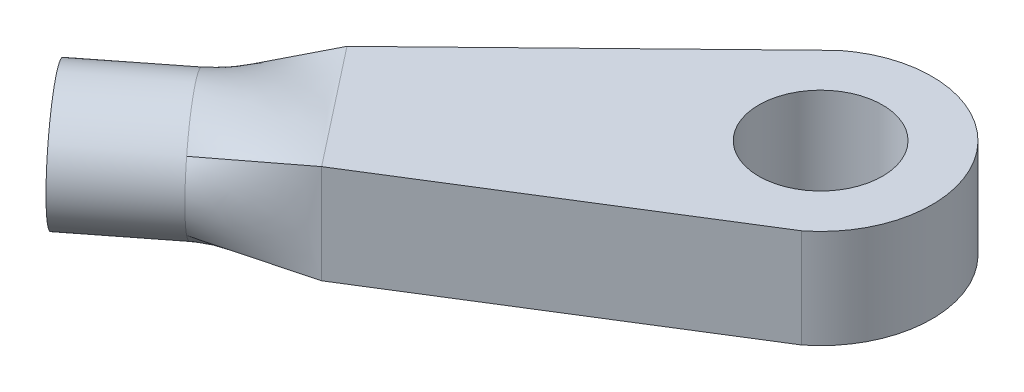
ISO-10303-21;
HEADER;
FILE_DESCRIPTION(('STEP AP214'),'2;1');
FILE_NAME('part.step','',(''),(''),'','','');
FILE_SCHEMA(('AUTOMOTIVE_DESIGN { 1 0 10303 214 1 1 1 1 }'));
ENDSEC;
DATA;
#1=APPLICATION_CONTEXT('core data for automotive mechanical design processes');
#2=APPLICATION_PROTOCOL_DEFINITION('international standard','automotive_design',2000,#1);
#3=PRODUCT_CONTEXT('',#1,'mechanical');
#4=PRODUCT('Part','Part','',(#3));
#5=PRODUCT_RELATED_PRODUCT_CATEGORY('part','',(#4));
#6=PRODUCT_DEFINITION_FORMATION('','',#4);
#7=PRODUCT_DEFINITION_CONTEXT('part definition',#1,'design');
#8=PRODUCT_DEFINITION('design','',#6,#7);
#9=PRODUCT_DEFINITION_SHAPE('','',#8);
#10=(LENGTH_UNIT() NAMED_UNIT(*) SI_UNIT(.MILLI.,.METRE.));
#11=(NAMED_UNIT(*) PLANE_ANGLE_UNIT() SI_UNIT($,.RADIAN.));
#12=(NAMED_UNIT(*) SI_UNIT($,.STERADIAN.) SOLID_ANGLE_UNIT());
#13=UNCERTAINTY_MEASURE_WITH_UNIT(LENGTH_MEASURE(1.E-05),#10,'distance_accuracy_value','');
#14=(GEOMETRIC_REPRESENTATION_CONTEXT(3) GLOBAL_UNCERTAINTY_ASSIGNED_CONTEXT((#13)) GLOBAL_UNIT_ASSIGNED_CONTEXT((#10,
#11,#12)) REPRESENTATION_CONTEXT('',''));
#15=CARTESIAN_POINT('',(0.,0.,0.));
#16=DIRECTION('',(0.,0.,1.));
#17=DIRECTION('',(1.,0.,0.));
#18=AXIS2_PLACEMENT_3D('',#15,#16,#17);
#19=CARTESIAN_POINT('',(2.368376701358,4.,3.79621636558901));
#20=DIRECTION('',(-0.529314363787313,0.,-0.848425780070615));
#21=DIRECTION('',(-0.848425780070615,0.,0.529314363787313));
#22=AXIS2_PLACEMENT_3D('',#19,#20,#21);
#23=PLANE('',#22);
#24=DIRECTION('',(0.848425780070615,0.,-0.529314363787313));
#25=VECTOR('',#24,1.);
#26=CARTESIAN_POINT('',(2.368376701358,0.,3.79621636558901));
#27=LINE('',#26,#25);
#28=CARTESIAN_POINT('',(-9.1786423882137,0.,11.0001500585608));
#29=VERTEX_POINT('',#28);
#30=CARTESIAN_POINT('',(2.77485421300522,0.,3.54262389995992));
#31=VERTEX_POINT('',#30);
#32=EDGE_CURVE('E216',#29,#31,#27,.T.);
#33=ORIENTED_EDGE('',*,*,#32,.T.);
#34=DIRECTION('',(0.,-1.,0.));
#35=VECTOR('',#34,1.);
#36=CARTESIAN_POINT('',(2.77485421300522,4.,3.54262389995992));
#37=LINE('',#36,#35);
#38=CARTESIAN_POINT('',(2.77485421300522,4.,3.54262389995992));
#39=VERTEX_POINT('',#38);
#40=EDGE_CURVE('E12',#39,#31,#37,.T.);
#41=ORIENTED_EDGE('',*,*,#40,.F.);
#42=DIRECTION('',(0.848425780070615,0.,-0.529314363787313));
#43=VECTOR('',#42,1.);
#44=CARTESIAN_POINT('',(2.368376701358,4.,3.79621636558901));
#45=LINE('',#44,#43);
#46=CARTESIAN_POINT('',(-9.17864238821368,4.,11.0001500585608));
#47=VERTEX_POINT('',#46);
#48=EDGE_CURVE('E219',#47,#39,#45,.T.);
#49=ORIENTED_EDGE('',*,*,#48,.F.);
#50=DIRECTION('',(0.,1.,0.));
#51=VECTOR('',#50,1.);
#52=CARTESIAN_POINT('',(-9.17864238821372,4.,11.0001500585608));
#53=LINE('',#52,#51);
#54=EDGE_CURVE('E232',#47,#29,#53,.F.);
#55=ORIENTED_EDGE('',*,*,#54,.T.);
#56=EDGE_LOOP('',(#33,#41,#49,#55));
#57=FACE_BOUND('',#56,.T.);
#58=ADVANCED_FACE('F68',(#57),#23,.F.);
#59=CARTESIAN_POINT('',(0.,4.,0.));
#60=DIRECTION('',(0.,-1.,0.));
#61=DIRECTION('',(0.,0.,-1.));
#62=AXIS2_PLACEMENT_3D('',#59,#60,#61);
#63=CYLINDRICAL_SURFACE('',#62,4.5);
#64=CARTESIAN_POINT('',(0.,0.,0.));
#65=DIRECTION('',(0.,1.,0.));
#66=DIRECTION('',(0.,0.,1.));
#67=AXIS2_PLACEMENT_3D('',#64,#65,#66);
#68=CIRCLE('',#67,4.5);
#69=CARTESIAN_POINT('',(-2.77485421300522,0.,-3.54262389995991));
#70=VERTEX_POINT('',#69);
#71=EDGE_CURVE('E208',#31,#70,#68,.T.);
#72=ORIENTED_EDGE('',*,*,#71,.T.);
#73=DIRECTION('',(0.,-1.,0.));
#74=VECTOR('',#73,1.);
#75=CARTESIAN_POINT('',(-2.77485421300522,4.,-3.54262389995991));
#76=LINE('',#75,#74);
#77=CARTESIAN_POINT('',(-2.77485421300522,4.,-3.54262389995991));
#78=VERTEX_POINT('',#77);
#79=EDGE_CURVE('E78',#78,#70,#76,.T.);
#80=ORIENTED_EDGE('',*,*,#79,.F.);
#81=CARTESIAN_POINT('',(0.,4.,0.));
#82=DIRECTION('',(0.,1.,0.));
#83=DIRECTION('',(0.,0.,1.));
#84=AXIS2_PLACEMENT_3D('',#81,#82,#83);
#85=CIRCLE('',#84,4.5);
#86=EDGE_CURVE('E226',#39,#78,#85,.T.);
#87=ORIENTED_EDGE('',*,*,#86,.F.);
#88=ORIENTED_EDGE('',*,*,#40,.T.);
#89=EDGE_LOOP('',(#72,#80,#87,#88));
#90=FACE_BOUND('',#89,.T.);
#91=ADVANCED_FACE('F198',(#90),#63,.T.);
#92=CARTESIAN_POINT('',(-3.11842595611097,4.,-3.20872037581255));
#93=DIRECTION('',(-0.696944725908792,0.,-0.717124848982322));
#94=DIRECTION('',(-0.717124848982322,0.,0.696944725908792));
#95=AXIS2_PLACEMENT_3D('',#92,#93,#94);
#96=PLANE('',#95);
#97=DIRECTION('',(0.717124848982322,0.,-0.696944725908792));
#98=VECTOR('',#97,1.);
#99=CARTESIAN_POINT('',(-3.11842595611097,0.,-3.20872037581255));
#100=LINE('',#99,#98);
#101=CARTESIAN_POINT('',(-12.878448005554,0.,6.27665152528097));
#102=VERTEX_POINT('',#101);
#103=EDGE_CURVE('E215',#102,#70,#100,.T.);
#104=ORIENTED_EDGE('',*,*,#103,.F.);
#105=DIRECTION('',(0.,1.,0.));
#106=VECTOR('',#105,1.);
#107=CARTESIAN_POINT('',(-12.878448005554,4.,6.27665152528095));
#108=LINE('',#107,#106);
#109=CARTESIAN_POINT('',(-12.878448005554,4.,6.27665152528093));
#110=VERTEX_POINT('',#109);
#111=EDGE_CURVE('E229',#110,#102,#108,.F.);
#112=ORIENTED_EDGE('',*,*,#111,.F.);
#113=DIRECTION('',(0.717124848982322,0.,-0.696944725908792));
#114=VECTOR('',#113,1.);
#115=CARTESIAN_POINT('',(-3.11842595611097,4.,-3.20872037581255));
#116=LINE('',#115,#114);
#117=EDGE_CURVE('E224',#110,#78,#116,.T.);
#118=ORIENTED_EDGE('',*,*,#117,.T.);
#119=ORIENTED_EDGE('',*,*,#79,.T.);
#120=EDGE_LOOP('',(#104,#112,#118,#119));
#121=FACE_BOUND('',#120,.T.);
#122=ADVANCED_FACE('F192',(#121),#96,.T.);
#123=CARTESIAN_POINT('',(0.,4.,0.));
#124=DIRECTION('',(0.,1.,0.));
#125=DIRECTION('',(0.,0.,1.));
#126=AXIS2_PLACEMENT_3D('',#123,#124,#125);
#127=PLANE('',#126);
#128=CARTESIAN_POINT('',(0.,4.,0.));
#129=DIRECTION('',(0.,1.,0.));
#130=DIRECTION('',(0.,0.,1.));
#131=AXIS2_PLACEMENT_3D('',#128,#129,#130);
#132=CIRCLE('',#131,2.5);
#133=CARTESIAN_POINT('',(0.,4.,2.5));
#134=VERTEX_POINT('',#133);
#135=EDGE_CURVE('E152',#134,#134,#132,.T.);
#136=ORIENTED_EDGE('',*,*,#135,.F.);
#137=EDGE_LOOP('',(#136));
#138=FACE_BOUND('',#137,.T.);
#139=ORIENTED_EDGE('',*,*,#48,.T.);
#140=ORIENTED_EDGE('',*,*,#86,.T.);
#141=ORIENTED_EDGE('',*,*,#117,.F.);
#142=DIRECTION('',(0.616634269556715,0.,0.787249755546648));
#143=VECTOR('',#142,1.);
#144=CARTESIAN_POINT('',(-12.878448005554,4.,6.27665152528095));
#145=LINE('',#144,#143);
#146=EDGE_CURVE('E86',#110,#47,#145,.T.);
#147=ORIENTED_EDGE('',*,*,#146,.T.);
#148=EDGE_LOOP('',(#139,#140,#141,#147));
#149=FACE_BOUND('',#148,.T.);
#150=ADVANCED_FACE('F189',(#138,#149),#127,.T.);
#151=CARTESIAN_POINT('',(0.,0.,0.));
#152=DIRECTION('',(0.,1.,0.));
#153=DIRECTION('',(0.,0.,1.));
#154=AXIS2_PLACEMENT_3D('',#151,#152,#153);
#155=PLANE('',#154);
#156=CARTESIAN_POINT('',(0.,0.,0.));
#157=DIRECTION('',(0.,1.,0.));
#158=DIRECTION('',(0.,0.,1.));
#159=AXIS2_PLACEMENT_3D('',#156,#157,#158);
#160=CIRCLE('',#159,2.5);
#161=CARTESIAN_POINT('',(0.,0.,2.5));
#162=VERTEX_POINT('',#161);
#163=EDGE_CURVE('E223',#162,#162,#160,.T.);
#164=ORIENTED_EDGE('',*,*,#163,.T.);
#165=EDGE_LOOP('',(#164));
#166=FACE_BOUND('',#165,.T.);
#167=ORIENTED_EDGE('',*,*,#32,.F.);
#168=DIRECTION('',(-0.616634269556715,0.,-0.787249755546648));
#169=VECTOR('',#168,1.);
#170=CARTESIAN_POINT('',(-9.17864238821371,0.,11.0001500585608));
#171=LINE('',#170,#169);
#172=EDGE_CURVE('E142',#102,#29,#171,.F.);
#173=ORIENTED_EDGE('',*,*,#172,.F.);
#174=ORIENTED_EDGE('',*,*,#103,.T.);
#175=ORIENTED_EDGE('',*,*,#71,.F.);
#176=EDGE_LOOP('',(#167,#173,#174,#175));
#177=FACE_BOUND('',#176,.T.);
#178=ADVANCED_FACE('F187',(#166,#177),#155,.F.);
#179=CARTESIAN_POINT('',(0.,-2.,0.));
#180=DIRECTION('',(0.,1.,0.));
#181=DIRECTION('',(0.,0.,1.));
#182=AXIS2_PLACEMENT_3D('',#179,#180,#181);
#183=CYLINDRICAL_SURFACE('',#182,2.5);
#184=ORIENTED_EDGE('',*,*,#135,.T.);
#185=EDGE_LOOP('',(#184));
#186=FACE_BOUND('',#185,.T.);
#187=ORIENTED_EDGE('',*,*,#163,.F.);
#188=EDGE_LOOP('',(#187));
#189=FACE_BOUND('',#188,.T.);
#190=ADVANCED_FACE('F178',(#186,#189),#183,.F.);
#191=CARTESIAN_POINT('',(-12.878448005554,4.,6.27665152528095));
#192=CARTESIAN_POINT('',(-15.4602210327791,3.37313717208592,9.4673593930978));
#193=CARTESIAN_POINT('',(-12.878448005554,3.66666666666667,6.27665152528095));
#194=CARTESIAN_POINT('',(-15.5392767083633,3.18082947977823,9.36642993725848));
#195=CARTESIAN_POINT('',(-12.878448005554,3.33333333333333,6.27665152528095));
#196=CARTESIAN_POINT('',(-15.6050319848207,2.9619739900238,9.28248094533141));
#197=CARTESIAN_POINT('',(-12.878448005554,2.66666666666666,6.27665152528095));
#198=CARTESIAN_POINT('',(-15.695072172049,2.49075943487762,9.16752769202648));
#199=CARTESIAN_POINT('',(-12.878448005554,2.33333333333333,6.27665152528095));
#200=CARTESIAN_POINT('',(-15.7191298929622,2.23869971296617,9.13681348128113));
#201=CARTESIAN_POINT('',(-12.878448005554,1.66666666666666,6.27665152528095));
#202=CARTESIAN_POINT('',(-15.7191298929622,1.73407365007952,9.13681348128114));
#203=CARTESIAN_POINT('',(-12.878448005554,1.33333333333333,6.27665152528095));
#204=CARTESIAN_POINT('',(-15.695072172049,1.48201392816807,9.16752769202648));
#205=CARTESIAN_POINT('',(-12.878448005554,0.666666666666666,6.27665152528095));
#206=CARTESIAN_POINT('',(-15.6050319848207,1.01079937302189,9.28248094533141));
#207=CARTESIAN_POINT('',(-12.878448005554,0.333333333333333,6.27665152528095));
#208=CARTESIAN_POINT('',(-15.5392767083633,0.791943883267464,9.36642993725848));
#209=CARTESIAN_POINT('',(-12.878448005554,0.,6.27665152528095));
#210=CARTESIAN_POINT('',(-15.4602210327791,0.599636190959771,9.4673593930978));
#211=B_SPLINE_SURFACE_WITH_KNOTS('',3,1,((#191,#192),(#193,#194),(#195,#196),(#197,#198),(#199,
#200),(#201,#202),(#203,#204),(#205,#206),(#207,#208),(#209,#210)),.UNSPECIFIED.,.F.,.F.,.F.,(4,
2,2,2,4),(2,2),(0.,0.25,0.5,0.75,1.),(0.,1.),.UNSPECIFIED.);
#212=DIRECTION('',(-0.622417047974724,0.144561037666866,0.769219815643818));
#213=VECTOR('',#212,1.);
#214=CARTESIAN_POINT('',(-14.1693345191666,0.299818095479886,7.87200545918938));
#215=LINE('',#214,#213);
#216=CARTESIAN_POINT('',(-15.4603416391705,0.599505949114852,9.46720541632942));
#217=VERTEX_POINT('',#216);
#218=EDGE_CURVE('E146',#102,#217,#215,.T.);
#219=CARTESIAN_POINT('',(-14.1775442190704,1.98638668152284,11.1049378701478));
#220=DIRECTION('',(-0.787249755546648,0.,0.616634269556715));
#221=DIRECTION('',(0.616634269556715,0.,0.787249755546648));
#222=AXIS2_PLACEMENT_3D('',#219,#220,#221);
#223=CIRCLE('',#222,2.5);
#224=CARTESIAN_POINT('',(-15.4603417728438,3.37326782402596,9.46720524567022));
#225=VERTEX_POINT('',#224);
#226=EDGE_CURVE('E71',#217,#225,#223,.F.);
#227=DIRECTION('',(0.621813922153858,0.150978428222508,-0.768474437068077));
#228=VECTOR('',#227,1.);
#229=CARTESIAN_POINT('',(-14.1693345191666,3.68656858604296,7.87200545918938));
#230=LINE('',#229,#228);
#231=EDGE_CURVE('E254',#225,#110,#230,.T.);
#232=ORIENTED_EDGE('',*,*,#111,.T.);
#233=ORIENTED_EDGE('',*,*,#218,.T.);
#234=ORIENTED_EDGE('',*,*,#226,.T.);
#235=ORIENTED_EDGE('',*,*,#231,.T.);
#236=EDGE_LOOP('',(#232,#233,#234,#235));
#237=FACE_BOUND('',#236,.T.);
#238=ADVANCED_FACE('F186',(#237),#211,.T.);
#239=CARTESIAN_POINT('',(-12.878448005554,0.,6.27665152528095));
#240=CARTESIAN_POINT('',(-15.4602210327791,0.599636190959771,9.4673593930978));
#241=CARTESIAN_POINT('',(-12.7242894381648,0.,6.47346396416762));
#242=CARTESIAN_POINT('',(-15.400929276091,0.455405421729002,9.54305648497728));
#243=CARTESIAN_POINT('',(-12.5701308707756,0.,6.67027640305428));
#244=CARTESIAN_POINT('',(-15.3289343587142,0.312952034292403,9.63497155344432));
#245=CARTESIAN_POINT('',(-12.2618137359973,0.,7.0639012808276));
#246=CARTESIAN_POINT('',(-15.1578127470126,0.0473890741596948,9.85344051248818));
#247=CARTESIAN_POINT('',(-12.1076551686081,0.,7.26071371971426));
#248=CARTESIAN_POINT('',(-15.058615253105,-0.0755837220929867,9.9800847920638));
#249=CARTESIAN_POINT('',(-11.7993380338297,0.,7.65433859748759));
#250=CARTESIAN_POINT('',(-14.8362780503926,-0.283436008543811,10.2639400967812));
#251=CARTESIAN_POINT('',(-11.6451794664406,0.,7.85115103637425));
#252=CARTESIAN_POINT('',(-14.7131409087821,-0.368089849056075,10.4211478444162));
#253=CARTESIAN_POINT('',(-11.3368623316622,0.,8.24477591414757));
#254=CARTESIAN_POINT('',(-14.4524697004717,-0.483271480336793,10.7539437254625));
#255=CARTESIAN_POINT('',(-11.182703764273,0.,8.44158835303423));
#256=CARTESIAN_POINT('',(-14.3150494882346,-0.513613318477156,10.9293865022135));
#257=CARTESIAN_POINT('',(-10.8743866294947,0.,8.83521323080756));
#258=CARTESIAN_POINT('',(-14.0400389499063,-0.513613318477156,11.280489238082));
#259=CARTESIAN_POINT('',(-10.7202280621055,0.,9.03202566969422));
#260=CARTESIAN_POINT('',(-13.9026187376692,-0.483271480336793,11.455932014833));
#261=CARTESIAN_POINT('',(-10.4119109273271,0.,9.42565054746754));
#262=CARTESIAN_POINT('',(-13.6419475293588,-0.368089849056075,11.7887278958793));
#263=CARTESIAN_POINT('',(-10.257752359938,0.,9.6224629863542));
#264=CARTESIAN_POINT('',(-13.5188103877483,-0.283436008543811,11.9459356435143));
#265=CARTESIAN_POINT('',(-9.94943522515961,0.,10.0160878641275));
#266=CARTESIAN_POINT('',(-13.2964731850359,-0.0755837220929872,12.2297909482317));
#267=CARTESIAN_POINT('',(-9.79527665777043,0.,10.2129003030142));
#268=CARTESIAN_POINT('',(-13.1972756911282,0.047389074159694,12.3564352278073));
#269=CARTESIAN_POINT('',(-9.48695952299207,0.,10.6065251807875));
#270=CARTESIAN_POINT('',(-13.0261540794267,0.312952034292402,12.5749041868512));
#271=CARTESIAN_POINT('',(-9.33280095560289,0.,10.8033376196742));
#272=CARTESIAN_POINT('',(-12.9541591620499,0.455405421729001,12.6668192553182));
#273=CARTESIAN_POINT('',(-9.17864238821371,0.,11.0001500585608));
#274=CARTESIAN_POINT('',(-12.8948674053618,0.599636190959771,12.7425163471977));
#275=B_SPLINE_SURFACE_WITH_KNOTS('',3,1,((#239,#240),(#241,#242),(#243,#244),(#245,#246),(#247,
#248),(#249,#250),(#251,#252),(#253,#254),(#255,#256),(#257,#258),(#259,#260),(#261,#262),(#263,
#264),(#265,#266),(#267,#268),(#269,#270),(#271,#272),(#273,#274)),.UNSPECIFIED.,.F.,.F.,.F.,(4,
2,2,2,2,2,2,2,4),(2,2),(0.,0.125,0.25,0.375,0.5,0.625,0.75,0.875,1.),(0.,1.),.UNSPECIFIED.);
#276=DIRECTION('',(-0.895912142698762,0.144561037666866,0.420051828889713));
#277=VECTOR('',#276,1.);
#278=CARTESIAN_POINT('',(-11.0367548967877,0.299818095479885,11.8713332028793));
#279=LINE('',#278,#277);
#280=CARTESIAN_POINT('',(-12.8947466652971,0.599505539019746,12.7426704946253));
#281=VERTEX_POINT('',#280);
#282=EDGE_CURVE('E139',#29,#281,#279,.T.);
#283=EDGE_CURVE('E119',#281,#217,#223,.F.);
#284=ORIENTED_EDGE('',*,*,#172,.T.);
#285=ORIENTED_EDGE('',*,*,#282,.T.);
#286=ORIENTED_EDGE('',*,*,#283,.T.);
#287=ORIENTED_EDGE('',*,*,#218,.F.);
#288=EDGE_LOOP('',(#284,#285,#286,#287));
#289=FACE_BOUND('',#288,.T.);
#290=ADVANCED_FACE('F140',(#289),#275,.T.);
#291=CARTESIAN_POINT('',(-9.17864238821371,4.,11.0001500585608));
#292=CARTESIAN_POINT('',(-12.8948674053618,3.37313717208592,12.7425163471977));
#293=CARTESIAN_POINT('',(-9.33280095560289,4.,10.8033376196742));
#294=CARTESIAN_POINT('',(-12.9541591620499,3.51736794131669,12.6668192553182));
#295=CARTESIAN_POINT('',(-9.48695952299207,4.,10.6065251807875));
#296=CARTESIAN_POINT('',(-13.0261540794267,3.65982132875329,12.5749041868512));
#297=CARTESIAN_POINT('',(-9.79527665777043,4.,10.2129003030142));
#298=CARTESIAN_POINT('',(-13.1972756911282,3.92538428888599,12.3564352278073));
#299=CARTESIAN_POINT('',(-9.94943522515961,4.,10.0160878641275));
#300=CARTESIAN_POINT('',(-13.2964731850359,4.04835708513868,12.2297909482317));
#301=CARTESIAN_POINT('',(-10.257752359938,4.,9.6224629863542));
#302=CARTESIAN_POINT('',(-13.5188103877483,4.2562093715895,11.9459356435143));
#303=CARTESIAN_POINT('',(-10.4119109273271,4.,9.42565054746754));
#304=CARTESIAN_POINT('',(-13.6419475293588,4.34086321210177,11.7887278958793));
#305=CARTESIAN_POINT('',(-10.7202280621055,4.,9.03202566969422));
#306=CARTESIAN_POINT('',(-13.9026187376692,4.45604484338248,11.455932014833));
#307=CARTESIAN_POINT('',(-10.8743866294947,4.,8.83521323080756));
#308=CARTESIAN_POINT('',(-14.0400389499063,4.48638668152285,11.280489238082));
#309=CARTESIAN_POINT('',(-11.182703764273,4.,8.44158835303423));
#310=CARTESIAN_POINT('',(-14.3150494882346,4.48638668152285,10.9293865022135));
#311=CARTESIAN_POINT('',(-11.3368623316622,4.,8.24477591414757));
#312=CARTESIAN_POINT('',(-14.4524697004717,4.45604484338248,10.7539437254625));
#313=CARTESIAN_POINT('',(-11.6451794664406,4.,7.85115103637425));
#314=CARTESIAN_POINT('',(-14.7131409087821,4.34086321210177,10.4211478444162));
#315=CARTESIAN_POINT('',(-11.7993380338298,4.,7.65433859748759));
#316=CARTESIAN_POINT('',(-14.8362780503926,4.2562093715895,10.2639400967812));
#317=CARTESIAN_POINT('',(-12.1076551686081,4.,7.26071371971426));
#318=CARTESIAN_POINT('',(-15.058615253105,4.04835708513868,9.9800847920638));
#319=CARTESIAN_POINT('',(-12.2618137359973,4.,7.0639012808276));
#320=CARTESIAN_POINT('',(-15.1578127470127,3.925384288886,9.85344051248818));
#321=CARTESIAN_POINT('',(-12.5701308707756,4.,6.67027640305428));
#322=CARTESIAN_POINT('',(-15.3289343587142,3.65982132875329,9.63497155344433));
#323=CARTESIAN_POINT('',(-12.7242894381648,4.,6.47346396416761));
#324=CARTESIAN_POINT('',(-15.400929276091,3.51736794131669,9.54305648497728));
#325=CARTESIAN_POINT('',(-12.878448005554,4.,6.27665152528095));
#326=CARTESIAN_POINT('',(-15.4602210327791,3.37313717208592,9.4673593930978));
#327=B_SPLINE_SURFACE_WITH_KNOTS('',3,1,((#291,#292),(#293,#294),(#295,#296),(#297,#298),(#299,
#300),(#301,#302),(#303,#304),(#305,#306),(#307,#308),(#309,#310),(#311,#312),(#313,#314),(#315,
#316),(#317,#318),(#319,#320),(#321,#322),(#323,#324),(#325,#326)),.UNSPECIFIED.,.F.,.F.,.F.,(4,
2,2,2,2,2,2,2,4),(2,2),(0.,0.125,0.25,0.375,0.5,0.625,0.75,0.875,1.),(0.,1.),.UNSPECIFIED.);
#328=CARTESIAN_POINT('',(-12.8947467989705,3.37326741393081,12.7426703239661));
#329=VERTEX_POINT('',#328);
#330=EDGE_CURVE('E245',#225,#329,#223,.F.);
#331=DIRECTION('',(-0.895043998504692,-0.150978428222508,0.419644796169562));
#332=VECTOR('',#331,1.);
#333=CARTESIAN_POINT('',(-11.0367548967878,3.68656858604296,11.8713332028793));
#334=LINE('',#333,#332);
#335=EDGE_CURVE('E145',#47,#329,#334,.T.);
#336=ORIENTED_EDGE('',*,*,#146,.F.);
#337=ORIENTED_EDGE('',*,*,#231,.F.);
#338=ORIENTED_EDGE('',*,*,#330,.T.);
#339=ORIENTED_EDGE('',*,*,#335,.F.);
#340=EDGE_LOOP('',(#336,#337,#338,#339));
#341=FACE_BOUND('',#340,.T.);
#342=ADVANCED_FACE('F173',(#341),#327,.T.);
#343=CARTESIAN_POINT('',(-9.17864238821372,0.,11.0001500585608));
#344=CARTESIAN_POINT('',(-12.8948674053618,0.59963619095977,12.7425163471977));
#345=CARTESIAN_POINT('',(-9.17864238821372,0.333333333333334,11.0001500585608));
#346=CARTESIAN_POINT('',(-12.8158117297776,0.791943883267463,12.843445803037));
#347=CARTESIAN_POINT('',(-9.17864238821372,0.666666666666667,11.0001500585608));
#348=CARTESIAN_POINT('',(-12.7500564533202,1.01079937302189,12.9273947949641));
#349=CARTESIAN_POINT('',(-9.17864238821372,1.33333333333333,11.0001500585608));
#350=CARTESIAN_POINT('',(-12.6600162660919,1.48201392816807,13.042348048269));
#351=CARTESIAN_POINT('',(-9.17864238821372,1.66666666666667,11.0001500585608));
#352=CARTESIAN_POINT('',(-12.6359585451787,1.73407365007951,13.0730622590144));
#353=CARTESIAN_POINT('',(-9.17864238821372,2.33333333333333,11.0001500585608));
#354=CARTESIAN_POINT('',(-12.6359585451787,2.23869971296617,13.0730622590144));
#355=CARTESIAN_POINT('',(-9.17864238821372,2.66666666666667,11.0001500585608));
#356=CARTESIAN_POINT('',(-12.6600162660919,2.49075943487762,13.042348048269));
#357=CARTESIAN_POINT('',(-9.17864238821372,3.33333333333333,11.0001500585608));
#358=CARTESIAN_POINT('',(-12.7500564533202,2.9619739900238,12.9273947949641));
#359=CARTESIAN_POINT('',(-9.17864238821372,3.66666666666667,11.0001500585608));
#360=CARTESIAN_POINT('',(-12.8158117297776,3.18082947977823,12.843445803037));
#361=CARTESIAN_POINT('',(-9.17864238821372,4.,11.0001500585608));
#362=CARTESIAN_POINT('',(-12.8948674053618,3.37313717208592,12.7425163471977));
#363=B_SPLINE_SURFACE_WITH_KNOTS('',3,1,((#343,#344),(#345,#346),(#347,#348),(#349,#350),(#351,
#352),(#353,#354),(#355,#356),(#357,#358),(#359,#360),(#361,#362)),.UNSPECIFIED.,.F.,.F.,.F.,(4,
2,2,2,4),(2,2),(0.,0.25,0.5,0.75,1.),(0.,1.),.UNSPECIFIED.);
#364=EDGE_CURVE('E125',#329,#281,#223,.F.);
#365=ORIENTED_EDGE('',*,*,#54,.F.);
#366=ORIENTED_EDGE('',*,*,#335,.T.);
#367=ORIENTED_EDGE('',*,*,#364,.T.);
#368=ORIENTED_EDGE('',*,*,#282,.F.);
#369=EDGE_LOOP('',(#365,#366,#367,#368));
#370=FACE_BOUND('',#369,.T.);
#371=ADVANCED_FACE('F150',(#370),#363,.T.);
#372=CARTESIAN_POINT('',(-8.61084781272558,1.98638668152284,6.74467513499209));
#373=DIRECTION('',(-0.787249755546648,0.,0.616634269556715));
#374=DIRECTION('',(0.616634269556715,0.,0.787249755546648));
#375=AXIS2_PLACEMENT_3D('',#372,#373,#374);
#376=CYLINDRICAL_SURFACE('',#375,2.5);
#377=ORIENTED_EDGE('',*,*,#283,.F.);
#378=ORIENTED_EDGE('',*,*,#364,.F.);
#379=ORIENTED_EDGE('',*,*,#330,.F.);
#380=ORIENTED_EDGE('',*,*,#226,.F.);
#381=EDGE_LOOP('',(#377,#378,#379,#380));
#382=FACE_BOUND('',#381,.T.);
#383=CARTESIAN_POINT('',(-17.326543241257,1.98638668152284,13.5714749483746));
#384=DIRECTION('',(-0.787249755546648,0.,0.616634269556715));
#385=DIRECTION('',(0.616634269556715,0.,0.787249755546648));
#386=AXIS2_PLACEMENT_3D('',#383,#384,#385);
#387=CIRCLE('',#386,2.5);
#388=CARTESIAN_POINT('',(-15.7849575673653,1.98638668152284,15.5395993372412));
#389=VERTEX_POINT('',#388);
#390=EDGE_CURVE('E258',#389,#389,#387,.T.);
#391=ORIENTED_EDGE('',*,*,#390,.F.);
#392=EDGE_LOOP('',(#391));
#393=FACE_BOUND('',#392,.T.);
#394=ADVANCED_FACE('F122',(#382,#393),#376,.T.);
#395=CARTESIAN_POINT('',(-17.326543241257,1.98638668152284,13.5714749483746));
#396=DIRECTION('',(-0.787249755546648,0.,0.616634269556715));
#397=DIRECTION('',(0.616634269556715,0.,0.787249755546648));
#398=AXIS2_PLACEMENT_3D('',#395,#396,#397);
#399=PLANE('',#398);
#400=CARTESIAN_POINT('',(-17.326543241257,1.98638668152284,13.5714749483746));
#401=DIRECTION('',(-0.787249755546648,0.,0.616634269556715));
#402=DIRECTION('',(0.616634269556715,0.,0.787249755546648));
#403=AXIS2_PLACEMENT_3D('',#400,#401,#402);
#404=CIRCLE('',#403,1.25);
#405=CARTESIAN_POINT('',(-16.5557504043112,1.98638668152284,14.5555371428079));
#406=VERTEX_POINT('',#405);
#407=EDGE_CURVE('E413',#406,#406,#404,.T.);
#408=ORIENTED_EDGE('',*,*,#407,.F.);
#409=EDGE_LOOP('',(#408));
#410=FACE_BOUND('',#409,.T.);
#411=ORIENTED_EDGE('',*,*,#390,.T.);
#412=EDGE_LOOP('',(#411));
#413=FACE_BOUND('',#412,.T.);
#414=ADVANCED_FACE('F274',(#410,#413),#399,.T.);
#415=CARTESIAN_POINT('',(-12.6030447079772,1.98638668152284,9.87166933103432));
#416=DIRECTION('',(-0.787249755546648,0.,0.616634269556715));
#417=DIRECTION('',(0.616634269556715,0.,0.787249755546648));
#418=AXIS2_PLACEMENT_3D('',#415,#416,#417);
#419=CYLINDRICAL_SURFACE('',#418,1.25);
#420=CARTESIAN_POINT('',(-12.6030447079772,1.98638668152284,9.87166933103432));
#421=DIRECTION('',(-0.787249755546648,0.,0.616634269556715));
#422=DIRECTION('',(0.616634269556715,0.,0.787249755546648));
#423=AXIS2_PLACEMENT_3D('',#420,#421,#422);
#424=CIRCLE('',#423,1.25);
#425=CARTESIAN_POINT('',(-11.8322518710313,1.98638668152284,10.8557315254676));
#426=VERTEX_POINT('',#425);
#427=EDGE_CURVE('E412',#426,#426,#424,.T.);
#428=ORIENTED_EDGE('',*,*,#427,.F.);
#429=EDGE_LOOP('',(#428));
#430=FACE_BOUND('',#429,.T.);
#431=ORIENTED_EDGE('',*,*,#407,.T.);
#432=EDGE_LOOP('',(#431));
#433=FACE_BOUND('',#432,.T.);
#434=ADVANCED_FACE('F374',(#430,#433),#419,.F.);
#435=CARTESIAN_POINT('',(-12.6030447079772,1.98638668152284,9.87166933103432));
#436=DIRECTION('',(-0.787249755546648,0.,0.616634269556715));
#437=DIRECTION('',(0.616634269556715,0.,0.787249755546648));
#438=AXIS2_PLACEMENT_3D('',#435,#436,#437);
#439=PLANE('',#438);
#440=ORIENTED_EDGE('',*,*,#427,.T.);
#441=EDGE_LOOP('',(#440));
#442=FACE_BOUND('',#441,.T.);
#443=ADVANCED_FACE('F395',(#442),#439,.T.);
#444=CLOSED_SHELL('',(#58,#91,#122,#150,#178,#190,#238,#290,#342,#371,#394,#414,#434,#443));
#445=MANIFOLD_SOLID_BREP('B2',#444);
#446=ADVANCED_BREP_SHAPE_REPRESENTATION('',(#18,#445),#14);
#447=SHAPE_DEFINITION_REPRESENTATION(#9,#446);
ENDSEC;
END-ISO-10303-21;
